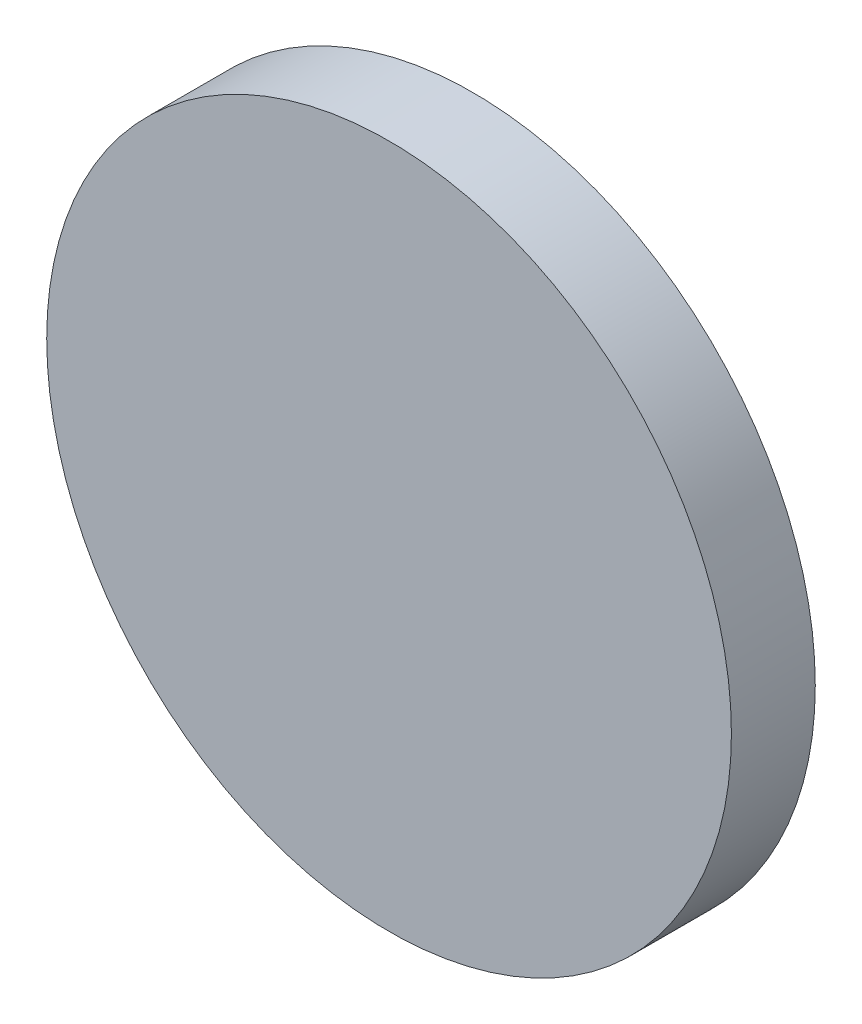
ISO-10303-21;
HEADER;
FILE_DESCRIPTION(('STEP AP214'),'2;1');
FILE_NAME('part.step','',(''),(''),'','','');
FILE_SCHEMA(('AUTOMOTIVE_DESIGN { 1 0 10303 214 1 1 1 1 }'));
ENDSEC;
DATA;
#1=APPLICATION_CONTEXT('core data for automotive mechanical design processes');
#2=APPLICATION_PROTOCOL_DEFINITION('international standard','automotive_design',2000,#1);
#3=PRODUCT_CONTEXT('',#1,'mechanical');
#4=PRODUCT('Part','Part','',(#3));
#5=PRODUCT_RELATED_PRODUCT_CATEGORY('part','',(#4));
#6=PRODUCT_DEFINITION_FORMATION('','',#4);
#7=PRODUCT_DEFINITION_CONTEXT('part definition',#1,'design');
#8=PRODUCT_DEFINITION('design','',#6,#7);
#9=PRODUCT_DEFINITION_SHAPE('','',#8);
#10=(LENGTH_UNIT() NAMED_UNIT(*) SI_UNIT(.MILLI.,.METRE.));
#11=(NAMED_UNIT(*) PLANE_ANGLE_UNIT() SI_UNIT($,.RADIAN.));
#12=(NAMED_UNIT(*) SI_UNIT($,.STERADIAN.) SOLID_ANGLE_UNIT());
#13=UNCERTAINTY_MEASURE_WITH_UNIT(LENGTH_MEASURE(1.E-05),#10,'distance_accuracy_value','');
#14=(GEOMETRIC_REPRESENTATION_CONTEXT(3) GLOBAL_UNCERTAINTY_ASSIGNED_CONTEXT((#13)) GLOBAL_UNIT_ASSIGNED_CONTEXT((#10,
#11,#12)) REPRESENTATION_CONTEXT('',''));
#15=CARTESIAN_POINT('',(0.,0.,0.));
#16=DIRECTION('',(0.,0.,1.));
#17=DIRECTION('',(1.,0.,0.));
#18=AXIS2_PLACEMENT_3D('',#15,#16,#17);
#19=CARTESIAN_POINT('',(0.,0.,10.));
#20=DIRECTION('',(0.,0.,-1.));
#21=DIRECTION('',(-1.,0.,0.));
#22=AXIS2_PLACEMENT_3D('',#19,#20,#21);
#23=CYLINDRICAL_SURFACE('',#22,40.8150101881723);
#24=CARTESIAN_POINT('',(0.,0.,10.));
#25=DIRECTION('',(0.,0.,1.));
#26=DIRECTION('',(1.,0.,0.));
#27=AXIS2_PLACEMENT_3D('',#24,#25,#26);
#28=CIRCLE('',#27,40.8150101881723);
#29=CARTESIAN_POINT('',(40.8150101881723,0.,10.));
#30=VERTEX_POINT('',#29);
#31=EDGE_CURVE('E10',#30,#30,#28,.T.);
#32=ORIENTED_EDGE('',*,*,#31,.F.);
#33=EDGE_LOOP('',(#32));
#34=FACE_BOUND('',#33,.T.);
#35=CARTESIAN_POINT('',(0.,0.,0.));
#36=DIRECTION('',(0.,0.,1.));
#37=DIRECTION('',(1.,0.,0.));
#38=AXIS2_PLACEMENT_3D('',#35,#36,#37);
#39=CIRCLE('',#38,40.8150101881723);
#40=CARTESIAN_POINT('',(40.8150101881723,0.,0.));
#41=VERTEX_POINT('',#40);
#42=EDGE_CURVE('E34',#41,#41,#39,.T.);
#43=ORIENTED_EDGE('',*,*,#42,.T.);
#44=EDGE_LOOP('',(#43));
#45=FACE_BOUND('',#44,.T.);
#46=ADVANCED_FACE('F31',(#34,#45),#23,.T.);
#47=CARTESIAN_POINT('',(0.,0.,10.));
#48=DIRECTION('',(0.,0.,1.));
#49=DIRECTION('',(1.,0.,0.));
#50=AXIS2_PLACEMENT_3D('',#47,#48,#49);
#51=PLANE('',#50);
#52=ORIENTED_EDGE('',*,*,#31,.T.);
#53=EDGE_LOOP('',(#52));
#54=FACE_BOUND('',#53,.T.);
#55=ADVANCED_FACE('F46',(#54),#51,.T.);
#56=CARTESIAN_POINT('',(0.,0.,0.));
#57=DIRECTION('',(0.,0.,1.));
#58=DIRECTION('',(1.,0.,0.));
#59=AXIS2_PLACEMENT_3D('',#56,#57,#58);
#60=PLANE('',#59);
#61=ORIENTED_EDGE('',*,*,#42,.F.);
#62=EDGE_LOOP('',(#61));
#63=FACE_BOUND('',#62,.T.);
#64=ADVANCED_FACE('F44',(#63),#60,.F.);
#65=CLOSED_SHELL('',(#46,#55,#64));
#66=MANIFOLD_SOLID_BREP('B2',#65);
#67=ADVANCED_BREP_SHAPE_REPRESENTATION('',(#18,#66),#14);
#68=SHAPE_DEFINITION_REPRESENTATION(#9,#67);
ENDSEC;
END-ISO-10303-21;
